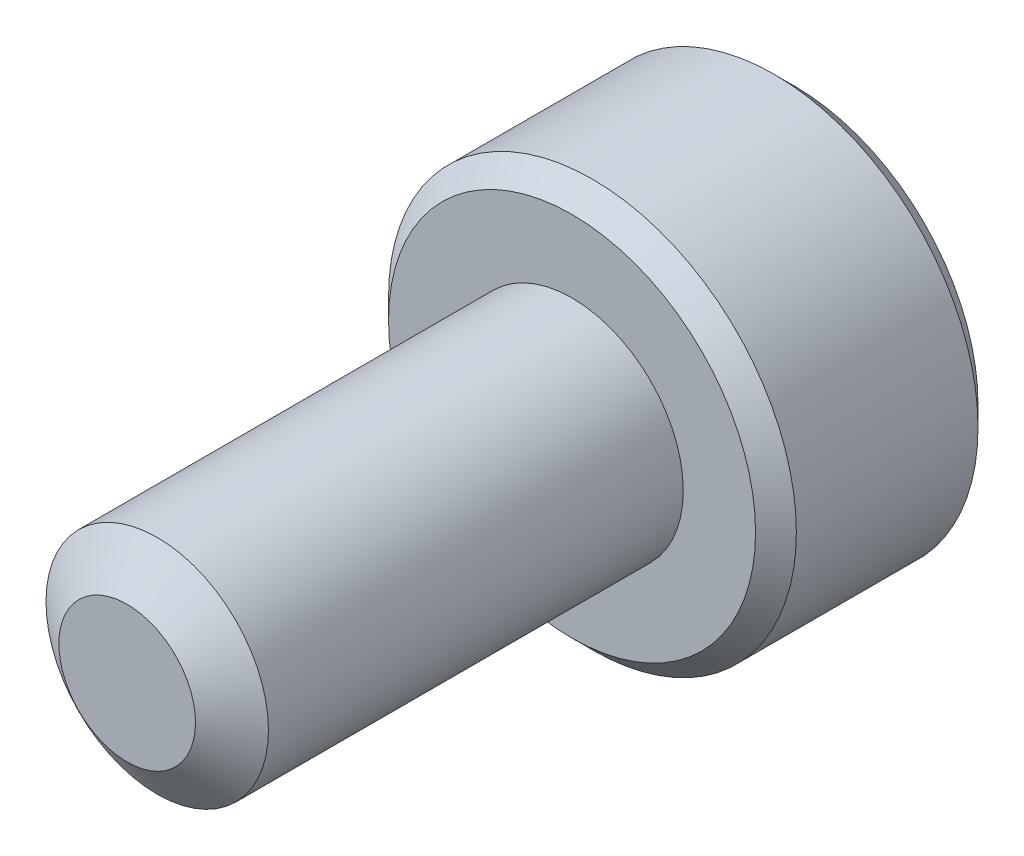
ISO-10303-21;
HEADER;
FILE_DESCRIPTION(('STEP AP214'),'2;1');
FILE_NAME('part.step','',(''),(''),'','','');
FILE_SCHEMA(('AUTOMOTIVE_DESIGN { 1 0 10303 214 1 1 1 1 }'));
ENDSEC;
DATA;
#1=APPLICATION_CONTEXT('core data for automotive mechanical design processes');
#2=APPLICATION_PROTOCOL_DEFINITION('international standard','automotive_design',2000,#1);
#3=PRODUCT_CONTEXT('',#1,'mechanical');
#4=PRODUCT('Part','Part','',(#3));
#5=PRODUCT_RELATED_PRODUCT_CATEGORY('part','',(#4));
#6=PRODUCT_DEFINITION_FORMATION('','',#4);
#7=PRODUCT_DEFINITION_CONTEXT('part definition',#1,'design');
#8=PRODUCT_DEFINITION('design','',#6,#7);
#9=PRODUCT_DEFINITION_SHAPE('','',#8);
#10=(LENGTH_UNIT() NAMED_UNIT(*) SI_UNIT(.MILLI.,.METRE.));
#11=(NAMED_UNIT(*) PLANE_ANGLE_UNIT() SI_UNIT($,.RADIAN.));
#12=(NAMED_UNIT(*) SI_UNIT($,.STERADIAN.) SOLID_ANGLE_UNIT());
#13=UNCERTAINTY_MEASURE_WITH_UNIT(LENGTH_MEASURE(1.E-05),#10,'distance_accuracy_value','');
#14=(GEOMETRIC_REPRESENTATION_CONTEXT(3) GLOBAL_UNCERTAINTY_ASSIGNED_CONTEXT((#13)) GLOBAL_UNIT_ASSIGNED_CONTEXT((#10,
#11,#12)) REPRESENTATION_CONTEXT('',''));
#15=CARTESIAN_POINT('',(0.,0.,0.));
#16=DIRECTION('',(0.,0.,1.));
#17=DIRECTION('',(1.,0.,0.));
#18=AXIS2_PLACEMENT_3D('',#15,#16,#17);
#19=CARTESIAN_POINT('',(0.,0.,-6.));
#20=DIRECTION('',(0.,0.,1.));
#21=DIRECTION('',(1.,0.,0.));
#22=AXIS2_PLACEMENT_3D('',#19,#20,#21);
#23=CYLINDRICAL_SURFACE('',#22,1.5);
#24=CARTESIAN_POINT('',(0.,0.,-6.));
#25=DIRECTION('',(0.,0.,-1.));
#26=DIRECTION('',(-1.,0.,0.));
#27=AXIS2_PLACEMENT_3D('',#24,#25,#26);
#28=CIRCLE('',#27,1.5);
#29=CARTESIAN_POINT('',(-1.5,0.,-6.));
#30=VERTEX_POINT('',#29);
#31=EDGE_CURVE('E216',#30,#30,#28,.F.);
#32=ORIENTED_EDGE('',*,*,#31,.T.);
#33=EDGE_LOOP('',(#32));
#34=FACE_BOUND('',#33,.T.);
#35=CARTESIAN_POINT('',(0.,0.,-0.40525178320938));
#36=DIRECTION('',(0.,0.,1.));
#37=DIRECTION('',(1.,0.,0.));
#38=AXIS2_PLACEMENT_3D('',#35,#36,#37);
#39=CIRCLE('',#38,1.5);
#40=CARTESIAN_POINT('',(1.5,0.,-0.40525178320938));
#41=VERTEX_POINT('',#40);
#42=EDGE_CURVE('E110',#41,#41,#39,.T.);
#43=ORIENTED_EDGE('',*,*,#42,.F.);
#44=EDGE_LOOP('',(#43));
#45=FACE_BOUND('',#44,.T.);
#46=ADVANCED_FACE('F36',(#34,#45),#23,.T.);
#47=CARTESIAN_POINT('',(0.,0.,0.));
#48=DIRECTION('',(0.,0.,-1.));
#49=DIRECTION('',(-1.,0.,0.));
#50=AXIS2_PLACEMENT_3D('',#47,#48,#49);
#51=CONICAL_SURFACE('',#50,0.921240473580834,0.959931088596884);
#52=ORIENTED_EDGE('',*,*,#42,.T.);
#53=EDGE_LOOP('',(#52));
#54=FACE_BOUND('',#53,.T.);
#55=CARTESIAN_POINT('',(0.,0.,0.));
#56=DIRECTION('',(0.,0.,1.));
#57=DIRECTION('',(1.,0.,0.));
#58=AXIS2_PLACEMENT_3D('',#55,#56,#57);
#59=CIRCLE('',#58,0.921240473580834);
#60=CARTESIAN_POINT('',(0.921240473580834,0.,0.));
#61=VERTEX_POINT('',#60);
#62=EDGE_CURVE('E214',#61,#61,#59,.T.);
#63=ORIENTED_EDGE('',*,*,#62,.F.);
#64=EDGE_LOOP('',(#63));
#65=FACE_BOUND('',#64,.T.);
#66=ADVANCED_FACE('F197',(#54,#65),#51,.T.);
#67=CARTESIAN_POINT('',(0.,0.,0.));
#68=DIRECTION('',(0.,0.,1.));
#69=DIRECTION('',(1.,0.,0.));
#70=AXIS2_PLACEMENT_3D('',#67,#68,#69);
#71=PLANE('',#70);
#72=ORIENTED_EDGE('',*,*,#62,.T.);
#73=EDGE_LOOP('',(#72));
#74=FACE_BOUND('',#73,.T.);
#75=ADVANCED_FACE('F194',(#74),#71,.T.);
#76=CARTESIAN_POINT('',(0.,0.,-9.));
#77=DIRECTION('',(0.,0.,1.));
#78=DIRECTION('',(1.,0.,0.));
#79=AXIS2_PLACEMENT_3D('',#76,#77,#78);
#80=CYLINDRICAL_SURFACE('',#79,2.75);
#81=CARTESIAN_POINT('',(0.,0.,-8.725));
#82=DIRECTION('',(0.,0.,-1.));
#83=DIRECTION('',(-1.,0.,0.));
#84=AXIS2_PLACEMENT_3D('',#81,#82,#83);
#85=CIRCLE('',#84,2.75);
#86=CARTESIAN_POINT('',(-2.75,0.,-8.725));
#87=VERTEX_POINT('',#86);
#88=EDGE_CURVE('E44',#87,#87,#85,.F.);
#89=ORIENTED_EDGE('',*,*,#88,.T.);
#90=EDGE_LOOP('',(#89));
#91=FACE_BOUND('',#90,.T.);
#92=CARTESIAN_POINT('',(0.,0.,-6.275));
#93=DIRECTION('',(0.,0.,-1.));
#94=DIRECTION('',(-1.,0.,0.));
#95=AXIS2_PLACEMENT_3D('',#92,#93,#94);
#96=CIRCLE('',#95,2.75);
#97=CARTESIAN_POINT('',(-2.75,0.,-6.275));
#98=VERTEX_POINT('',#97);
#99=EDGE_CURVE('E173',#98,#98,#96,.T.);
#100=ORIENTED_EDGE('',*,*,#99,.T.);
#101=EDGE_LOOP('',(#100));
#102=FACE_BOUND('',#101,.T.);
#103=ADVANCED_FACE('F178',(#91,#102),#80,.T.);
#104=CARTESIAN_POINT('',(0.,0.,-9.));
#105=DIRECTION('',(0.,0.,-1.));
#106=DIRECTION('',(-1.,0.,0.));
#107=AXIS2_PLACEMENT_3D('',#104,#105,#106);
#108=PLANE('',#107);
#109=CARTESIAN_POINT('',(0.,0.,-9.));
#110=DIRECTION('',(0.,0.,-1.));
#111=DIRECTION('',(-1.,0.,0.));
#112=AXIS2_PLACEMENT_3D('',#109,#110,#111);
#113=CIRCLE('',#112,2.475);
#114=CARTESIAN_POINT('',(-2.475,0.,-9.));
#115=VERTEX_POINT('',#114);
#116=EDGE_CURVE('E109',#115,#115,#113,.T.);
#117=ORIENTED_EDGE('',*,*,#116,.T.);
#118=EDGE_LOOP('',(#117));
#119=FACE_BOUND('',#118,.T.);
#120=CARTESIAN_POINT('',(0.,0.,-9.));
#121=DIRECTION('',(0.,0.,-1.));
#122=DIRECTION('',(-1.,0.,0.));
#123=AXIS2_PLACEMENT_3D('',#120,#121,#122);
#124=CIRCLE('',#123,1.44337567297406);
#125=CARTESIAN_POINT('',(-1.25,0.721687836487031,-9.));
#126=VERTEX_POINT('',#125);
#127=CARTESIAN_POINT('',(0.,1.44337567297406,-9.));
#128=VERTEX_POINT('',#127);
#129=EDGE_CURVE('E90',#126,#128,#124,.T.);
#130=ORIENTED_EDGE('',*,*,#129,.F.);
#131=CARTESIAN_POINT('',(-1.25,-0.721687836487032,-9.));
#132=VERTEX_POINT('',#131);
#133=EDGE_CURVE('E50',#132,#126,#124,.T.);
#134=ORIENTED_EDGE('',*,*,#133,.F.);
#135=CARTESIAN_POINT('',(0.,-1.44337567297406,-9.));
#136=VERTEX_POINT('',#135);
#137=EDGE_CURVE('E275',#136,#132,#124,.T.);
#138=ORIENTED_EDGE('',*,*,#137,.F.);
#139=CARTESIAN_POINT('',(1.25,-0.721687836487032,-9.));
#140=VERTEX_POINT('',#139);
#141=EDGE_CURVE('E57',#140,#136,#124,.T.);
#142=ORIENTED_EDGE('',*,*,#141,.F.);
#143=CARTESIAN_POINT('',(1.25,0.721687836487033,-9.));
#144=VERTEX_POINT('',#143);
#145=EDGE_CURVE('E131',#144,#140,#124,.T.);
#146=ORIENTED_EDGE('',*,*,#145,.F.);
#147=EDGE_CURVE('E99',#128,#144,#124,.T.);
#148=ORIENTED_EDGE('',*,*,#147,.F.);
#149=EDGE_LOOP('',(#130,#134,#138,#142,#146,#148));
#150=FACE_BOUND('',#149,.T.);
#151=ADVANCED_FACE('F130',(#119,#150),#108,.T.);
#152=CARTESIAN_POINT('',(0.,0.,-6.));
#153=DIRECTION('',(0.,0.,-1.));
#154=DIRECTION('',(-1.,0.,0.));
#155=AXIS2_PLACEMENT_3D('',#152,#153,#154);
#156=PLANE('',#155);
#157=CARTESIAN_POINT('',(0.,0.,-6.));
#158=DIRECTION('',(0.,0.,-1.));
#159=DIRECTION('',(-1.,0.,0.));
#160=AXIS2_PLACEMENT_3D('',#157,#158,#159);
#161=CIRCLE('',#160,2.475);
#162=CARTESIAN_POINT('',(-2.475,0.,-6.));
#163=VERTEX_POINT('',#162);
#164=EDGE_CURVE('E11',#163,#163,#161,.F.);
#165=ORIENTED_EDGE('',*,*,#164,.T.);
#166=EDGE_LOOP('',(#165));
#167=FACE_BOUND('',#166,.T.);
#168=ORIENTED_EDGE('',*,*,#31,.F.);
#169=EDGE_LOOP('',(#168));
#170=FACE_BOUND('',#169,.T.);
#171=ADVANCED_FACE('F187',(#167,#170),#156,.F.);
#172=CARTESIAN_POINT('',(0.,0.,-9.));
#173=DIRECTION('',(0.,0.,-1.));
#174=DIRECTION('',(-1.,0.,0.));
#175=AXIS2_PLACEMENT_3D('',#172,#173,#174);
#176=CONICAL_SURFACE('',#175,1.44337567297406,0.78539816339745);
#177=ORIENTED_EDGE('',*,*,#147,.T.);
#178=CARTESIAN_POINT('',(-0.000199999999999518,1.4434911430279,-9.00011548390914));
#179=CARTESIAN_POINT('',(0.0427751670715875,1.41867941875065,-8.9753216680551));
#180=CARTESIAN_POINT('',(0.0864690047459492,1.39345276980743,-8.95198373441868));
#181=CARTESIAN_POINT('',(0.175565930841943,1.34201263554194,-8.90925200408454));
#182=CARTESIAN_POINT('',(0.220977498357065,1.31579425481276,-8.88988199236042));
#183=CARTESIAN_POINT('',(0.312547820935261,1.26292610442246,-8.85670048341348));
#184=CARTESIAN_POINT('',(0.358683240175887,1.23628980770471,-8.84280555905266));
#185=CARTESIAN_POINT('',(0.451970080407593,1.18243062538508,-8.82139728216064));
#186=CARTESIAN_POINT('',(0.499118649136381,1.15520938653761,-8.81386794156679));
#187=CARTESIAN_POINT('',(0.580373556887253,1.10829684367467,-8.8070744980507));
#188=CARTESIAN_POINT('',(0.614374876627942,1.08866617256958,-8.80606855910435));
#189=CARTESIAN_POINT('',(0.682317764432479,1.04943932800611,-8.80776141491132));
#190=CARTESIAN_POINT('',(0.716259317655658,1.02984316311599,-8.81046102721554));
#191=CARTESIAN_POINT('',(0.7838148564575,0.990839954603498,-8.81940893031638));
#192=CARTESIAN_POINT('',(0.817428507286776,0.97143310424877,-8.82566052589971));
#193=CARTESIAN_POINT('',(0.884094638217814,0.932943395609905,-8.8413756814139));
#194=CARTESIAN_POINT('',(0.917146871030297,0.9138606800983,-8.85084062008746));
#195=CARTESIAN_POINT('',(1.00179969160026,0.864986351354567,-8.87893139068759));
#196=CARTESIAN_POINT('',(1.05286649242964,0.835502920149076,-8.8996701574522));
#197=CARTESIAN_POINT('',(1.15300085411325,0.777690319475909,-8.94638713467148));
#198=CARTESIAN_POINT('',(1.20207431157827,0.749357745598417,-8.97234829594677));
#199=CARTESIAN_POINT('',(1.2502,0.721572366433194,-9.00011548390914));
#200=B_SPLINE_CURVE_WITH_KNOTS('',3,(#178,#179,#180,#181,#182,#183,#184,#185,#186,#187,#188,
#189,#190,#191,#192,#193,#194,#195,#196,#197,#198,#199),.UNSPECIFIED.,.F.,.F.,(4,2,2,2,2,2,2,2,
2,2,4),(0.,0.166533409618305,0.334037607289762,0.498880396489699,0.663307919240275,
0.780963963458827,0.898645970148453,1.01643764860773,1.1342799317155,1.32148652032141,
1.50809158792573),.UNSPECIFIED.);
#201=EDGE_CURVE('E104',#128,#144,#200,.T.);
#202=ORIENTED_EDGE('',*,*,#201,.F.);
#203=EDGE_LOOP('',(#177,#202));
#204=FACE_BOUND('',#203,.T.);
#205=ADVANCED_FACE('F105',(#204),#176,.F.);
#206=ORIENTED_EDGE('',*,*,#145,.T.);
#207=CARTESIAN_POINT('',(1.25,-1.43934010808077,-9.46298209689233));
#208=CARTESIAN_POINT('',(1.25,-1.40429313005659,-9.43652492263289));
#209=CARTESIAN_POINT('',(1.25,-1.36905087135599,-9.41032716035428));
#210=CARTESIAN_POINT('',(1.25,-1.29809650706311,-9.35855757183958));
#211=CARTESIAN_POINT('',(1.25,-1.26238428576495,-9.3329859043563));
#212=CARTESIAN_POINT('',(1.25,-1.15390111792708,-9.25700599368946));
#213=CARTESIAN_POINT('',(1.25,-1.08031646726264,-9.20774028618957));
#214=CARTESIAN_POINT('',(1.25,-0.926012322755096,-9.11102583026313));
#215=CARTESIAN_POINT('',(1.25,-0.845125318656147,-9.0638412989418));
#216=CARTESIAN_POINT('',(1.25,-0.679311174076602,-8.97753073439041));
#217=CARTESIAN_POINT('',(1.25,-0.594398891026687,-8.9383775346269));
#218=CARTESIAN_POINT('',(1.25,-0.46694481246074,-8.89047722368829));
#219=CARTESIAN_POINT('',(1.25,-0.426289985812821,-8.87672948978634));
#220=CARTESIAN_POINT('',(1.25,-0.343998850091267,-8.85249792745054));
#221=CARTESIAN_POINT('',(1.25,-0.302362473614962,-8.84201432386977));
#222=CARTESIAN_POINT('',(1.25,-0.219052696285665,-8.8250301617483));
#223=CARTESIAN_POINT('',(1.25,-0.1773934284745,-8.81846136047137));
#224=CARTESIAN_POINT('',(1.25,-0.0936293693401921,-8.80943505345776));
#225=CARTESIAN_POINT('',(1.25,-0.051524655854396,-8.80697684099727));
#226=CARTESIAN_POINT('',(1.25,0.0311890576306315,-8.80635406201329));
#227=CARTESIAN_POINT('',(1.25,0.0717969625499303,-8.80803711684625));
#228=CARTESIAN_POINT('',(1.25,0.152668636885197,-8.81526827059791));
#229=CARTESIAN_POINT('',(1.25,0.192932338835358,-8.82081711041311));
#230=CARTESIAN_POINT('',(1.25,0.273499879165295,-8.83557103646496));
#231=CARTESIAN_POINT('',(1.25,0.313792180618512,-8.8448381759641));
#232=CARTESIAN_POINT('',(1.25,0.393496413911458,-8.86653617845735));
#233=CARTESIAN_POINT('',(1.25,0.43290841911506,-8.87896677673065));
#234=CARTESIAN_POINT('',(1.25,0.556992735862299,-8.92277935293144));
#235=CARTESIAN_POINT('',(1.25,0.639898924666086,-8.95915107287596));
#236=CARTESIAN_POINT('',(1.25,0.801816555499702,-9.04001916217834));
#237=CARTESIAN_POINT('',(1.25,0.880812666325045,-9.08454472091199));
#238=CARTESIAN_POINT('',(1.25,1.0317856127975,-9.17640487666663));
#239=CARTESIAN_POINT('',(1.25,1.10391618485086,-9.22348993391625));
#240=CARTESIAN_POINT('',(1.25,1.21018606043311,-9.29627856159854));
#241=CARTESIAN_POINT('',(1.25,1.2451506996938,-9.32079808539336));
#242=CARTESIAN_POINT('',(1.25,1.31460220852737,-9.37048563676568));
#243=CARTESIAN_POINT('',(1.25,1.34908920596618,-9.39565348541552));
#244=CARTESIAN_POINT('',(1.25,1.38337731682912,-9.42109014884122));
#245=B_SPLINE_CURVE_WITH_KNOTS('',3,(#207,#208,#209,#210,#211,#212,#213,#214,#215,#216,#217,
#218,#219,#220,#221,#222,#223,#224,#225,#226,#227,#228,#229,#230,#231,#232,#233,#234,#235,#236,
#237,#238,#239,#240,#241,#242,#243,#244),.UNSPECIFIED.,.F.,.F.,(4,2,2,2,2,2,2,2,2,2,2,2,2,2,2,2,
2,2,4),(0.,0.131732960381448,0.263498984161645,0.529042014455825,0.809741926134617,
1.08947609717225,1.21811634272576,1.346765447839,1.47310084517844,1.59941451973784,
1.72115042167849,1.84290966131735,1.96679153905342,2.09066305366039,2.36146692896009,
2.63325989198491,2.89154668212279,3.01965734507713,3.14773302245628),.UNSPECIFIED.);
#246=EDGE_CURVE('E98',#144,#140,#245,.F.);
#247=ORIENTED_EDGE('',*,*,#246,.F.);
#248=EDGE_LOOP('',(#206,#247));
#249=FACE_BOUND('',#248,.T.);
#250=ADVANCED_FACE('F281',(#249),#176,.F.);
#251=ORIENTED_EDGE('',*,*,#141,.T.);
#252=CARTESIAN_POINT('',(1.2502,-0.721572366433195,-9.00011548390914));
#253=CARTESIAN_POINT('',(1.20722483292841,-0.746384090710445,-8.9753216680551));
#254=CARTESIAN_POINT('',(1.16353099525405,-0.771610739653665,-8.95198373441868));
#255=CARTESIAN_POINT('',(1.07443406915806,-0.823050873919155,-8.90925200408454));
#256=CARTESIAN_POINT('',(1.02902250164294,-0.849269254648334,-8.88988199236042));
#257=CARTESIAN_POINT('',(0.93745217906474,-0.902137405038636,-8.85670048341348));
#258=CARTESIAN_POINT('',(0.891316759824114,-0.928773701756388,-8.84280555905266));
#259=CARTESIAN_POINT('',(0.798029919592408,-0.982632884076013,-8.82139728216064));
#260=CARTESIAN_POINT('',(0.75088135086362,-1.00985412292348,-8.81386794156679));
#261=CARTESIAN_POINT('',(0.669626443112748,-1.05676666578643,-8.8070744980507));
#262=CARTESIAN_POINT('',(0.635625123372059,-1.07639733689152,-8.80606855910435));
#263=CARTESIAN_POINT('',(0.567682235567523,-1.11562418145499,-8.80776141491132));
#264=CARTESIAN_POINT('',(0.533740682344343,-1.1352203463451,-8.81046102721554));
#265=CARTESIAN_POINT('',(0.466185143542501,-1.1742235548576,-8.81940893031638));
#266=CARTESIAN_POINT('',(0.432571492713226,-1.19363040521233,-8.82566052589971));
#267=CARTESIAN_POINT('',(0.365905361782187,-1.23212011385119,-8.8413756814139));
#268=CARTESIAN_POINT('',(0.332853128969705,-1.2512028293628,-8.85084062008746));
#269=CARTESIAN_POINT('',(0.248200308399736,-1.30007715810653,-8.87893139068759));
#270=CARTESIAN_POINT('',(0.197133507570362,-1.32956058931202,-8.8996701574522));
#271=CARTESIAN_POINT('',(0.0969991458867458,-1.38737318998519,-8.94638713467148));
#272=CARTESIAN_POINT('',(0.0479256884217313,-1.41570576386268,-8.97234829594677));
#273=CARTESIAN_POINT('',(-0.000199999999999432,-1.4434911430279,-9.00011548390914));
#274=B_SPLINE_CURVE_WITH_KNOTS('',3,(#252,#253,#254,#255,#256,#257,#258,#259,#260,#261,#262,
#263,#264,#265,#266,#267,#268,#269,#270,#271,#272,#273),.UNSPECIFIED.,.F.,.F.,(4,2,2,2,2,2,2,2,
2,2,4),(0.,0.166533409618304,0.334037607289761,0.498880396489698,0.663307919240274,
0.780963963458826,0.898645970148452,1.01643764860773,1.13427993171549,1.32148652032141,
1.50809158792573),.UNSPECIFIED.);
#275=EDGE_CURVE('E141',#140,#136,#274,.T.);
#276=ORIENTED_EDGE('',*,*,#275,.F.);
#277=EDGE_LOOP('',(#251,#276));
#278=FACE_BOUND('',#277,.T.);
#279=ADVANCED_FACE('F278',(#278),#176,.F.);
#280=ORIENTED_EDGE('',*,*,#137,.T.);
#281=CARTESIAN_POINT('',(0.000200000000000315,-1.4434911430279,-9.00011548390914));
#282=CARTESIAN_POINT('',(-0.0427751670715862,-1.41867941875065,-8.97532166805511));
#283=CARTESIAN_POINT('',(-0.0864690047459475,-1.39345276980743,-8.95198373441869));
#284=CARTESIAN_POINT('',(-0.175565930841941,-1.34201263554194,-8.90925200408454));
#285=CARTESIAN_POINT('',(-0.220977498357063,-1.31579425481276,-8.88988199236042));
#286=CARTESIAN_POINT('',(-0.312547820935259,-1.26292610442246,-8.85670048341348));
#287=CARTESIAN_POINT('',(-0.358683240175885,-1.23628980770471,-8.84280555905266));
#288=CARTESIAN_POINT('',(-0.451970080407592,-1.18243062538508,-8.82139728216064));
#289=CARTESIAN_POINT('',(-0.499118649136379,-1.15520938653761,-8.81386794156679));
#290=CARTESIAN_POINT('',(-0.580373556887252,-1.10829684367467,-8.8070744980507));
#291=CARTESIAN_POINT('',(-0.61437487662794,-1.08866617256958,-8.80606855910435));
#292=CARTESIAN_POINT('',(-0.682317764432477,-1.04943932800611,-8.80776141491132));
#293=CARTESIAN_POINT('',(-0.716259317655657,-1.02984316311599,-8.81046102721554));
#294=CARTESIAN_POINT('',(-0.783814856457499,-0.9908399546035,-8.81940893031638));
#295=CARTESIAN_POINT('',(-0.817428507286774,-0.971433104248772,-8.82566052589971));
#296=CARTESIAN_POINT('',(-0.884094638217813,-0.932943395609906,-8.8413756814139));
#297=CARTESIAN_POINT('',(-0.917146871030295,-0.913860680098301,-8.85084062008746));
#298=CARTESIAN_POINT('',(-1.00179969160026,-0.864986351354568,-8.87893139068759));
#299=CARTESIAN_POINT('',(-1.05286649242964,-0.835502920149076,-8.8996701574522));
#300=CARTESIAN_POINT('',(-1.15300085411326,-0.777690319475909,-8.94638713467148));
#301=CARTESIAN_POINT('',(-1.20207431157827,-0.749357745598417,-8.97234829594677));
#302=CARTESIAN_POINT('',(-1.2502,-0.721572366433195,-9.00011548390914));
#303=B_SPLINE_CURVE_WITH_KNOTS('',3,(#281,#282,#283,#284,#285,#286,#287,#288,#289,#290,#291,
#292,#293,#294,#295,#296,#297,#298,#299,#300,#301,#302),.UNSPECIFIED.,.F.,.F.,(4,2,2,2,2,2,2,2,
2,2,4),(0.,0.166533409618303,0.334037607289761,0.498880396489698,0.663307919240274,
0.780963963458826,0.898645970148453,1.01643764860773,1.13427993171549,1.32148652032141,
1.50809158792574),.UNSPECIFIED.);
#304=EDGE_CURVE('E252',#136,#132,#303,.T.);
#305=ORIENTED_EDGE('',*,*,#304,.F.);
#306=EDGE_LOOP('',(#280,#305));
#307=FACE_BOUND('',#306,.T.);
#308=ADVANCED_FACE('F277',(#307),#176,.F.);
#309=ORIENTED_EDGE('',*,*,#133,.T.);
#310=CARTESIAN_POINT('',(-1.25,-1.43934010829019,-9.46298209705044));
#311=CARTESIAN_POINT('',(-1.25,-1.40429313026013,-9.43652492278491));
#312=CARTESIAN_POINT('',(-1.25,-1.36905087155364,-9.41032716050022));
#313=CARTESIAN_POINT('',(-1.25,-1.29809650724891,-9.3585575719734));
#314=CARTESIAN_POINT('',(-1.25,-1.2623842859448,-9.33298590448407));
#315=CARTESIAN_POINT('',(-1.25,-1.1539011180887,-9.25700599379899));
#316=CARTESIAN_POINT('',(-1.25,-1.08031646741187,-9.20774028628697));
#317=CARTESIAN_POINT('',(-1.25,-0.926012322877301,-9.11102583033562));
#318=CARTESIAN_POINT('',(-1.25,-0.845125318763648,-9.06384129900157));
#319=CARTESIAN_POINT('',(-1.25,-0.679311174153443,-8.97753073442662));
#320=CARTESIAN_POINT('',(-1.25,-0.594398891087584,-8.93837753465223));
#321=CARTESIAN_POINT('',(-1.25,-0.466944812509639,-8.89047722370555));
#322=CARTESIAN_POINT('',(-1.25,-0.426289985866744,-8.87672948980391));
#323=CARTESIAN_POINT('',(-1.25,-0.343998850155402,-8.85249792746773));
#324=CARTESIAN_POINT('',(-1.25,-0.302362473684285,-8.84201432388626));
#325=CARTESIAN_POINT('',(-1.25,-0.219052696365195,-8.8250301617622));
#326=CARTESIAN_POINT('',(-1.25,-0.177393428559044,-8.81846136048343));
#327=CARTESIAN_POINT('',(-1.25,-0.0936293694345978,-8.80943505346499));
#328=CARTESIAN_POINT('',(-1.25,-0.0515246559536487,-8.80697684100152));
#329=CARTESIAN_POINT('',(-1.25,0.0311890575224388,-8.80635406201073));
#330=CARTESIAN_POINT('',(-1.25,0.071796962437632,-8.80803711683992));
#331=CARTESIAN_POINT('',(-1.25,0.152668636765093,-8.81526827058346));
#332=CARTESIAN_POINT('',(-1.25,0.192932338711554,-8.8208171103943));
#333=CARTESIAN_POINT('',(-1.25,0.273499879034189,-8.83557103643701));
#334=CARTESIAN_POINT('',(-1.25,0.313792180483814,-8.84483817593136));
#335=CARTESIAN_POINT('',(-1.25,0.393496413769926,-8.86653617841489));
#336=CARTESIAN_POINT('',(-1.25,0.432908418970283,-8.87896677668328));
#337=CARTESIAN_POINT('',(-1.25,0.556992735685997,-8.92277935286094));
#338=CARTESIAN_POINT('',(-1.25,0.639898924463083,-8.95915107278418));
#339=CARTESIAN_POINT('',(-1.25,0.801816555245347,-9.04001916204164));
#340=CARTESIAN_POINT('',(-1.25,0.880812666046053,-9.08454472075164));
#341=CARTESIAN_POINT('',(-1.25,1.03178561247421,-9.17640487646102));
#342=CARTESIAN_POINT('',(-1.25,1.10391618450775,-9.22348993368924));
#343=CARTESIAN_POINT('',(-1.25,1.2101860600607,-9.29627856133953));
#344=CARTESIAN_POINT('',(-1.25,1.24515069931176,-9.32079808512376));
#345=CARTESIAN_POINT('',(-1.25,1.31460220812614,-9.37048563647494));
#346=CARTESIAN_POINT('',(-1.25,1.3490892055554,-9.39565348511421));
#347=CARTESIAN_POINT('',(-1.25,1.38337731640879,-9.42109014852934));
#348=B_SPLINE_CURVE_WITH_KNOTS('',3,(#310,#311,#312,#313,#314,#315,#316,#317,#318,#319,#320,
#321,#322,#323,#324,#325,#326,#327,#328,#329,#330,#331,#332,#333,#334,#335,#336,#337,#338,#339,
#340,#341,#342,#343,#344,#345,#346,#347),.UNSPECIFIED.,.F.,.F.,(4,2,2,2,2,2,2,2,2,2,2,2,2,2,2,2,
2,2,4),(0.,0.131732960406521,0.263498984211801,0.529042014557081,0.809741926293178,
1.08947609738757,1.21811634292656,1.34676544802529,1.47310084535082,1.59941451989631,
1.72115042182424,1.84290966145034,1.96679153917269,2.09066305376595,2.36146692896707,
2.63325989189267,2.89154668194565,3.01965734485811,3.1477330221954),.UNSPECIFIED.);
#349=EDGE_CURVE('E120',#132,#126,#348,.T.);
#350=ORIENTED_EDGE('',*,*,#349,.F.);
#351=EDGE_LOOP('',(#309,#350));
#352=FACE_BOUND('',#351,.T.);
#353=ADVANCED_FACE('F290',(#352),#176,.F.);
#354=ORIENTED_EDGE('',*,*,#129,.T.);
#355=CARTESIAN_POINT('',(-1.2502,0.721572366433194,-9.00011548390914));
#356=CARTESIAN_POINT('',(-1.20722483292841,0.746384090710444,-8.9753216680551));
#357=CARTESIAN_POINT('',(-1.16353099525405,0.771610739653664,-8.95198373441868));
#358=CARTESIAN_POINT('',(-1.07443406915806,0.823050873919154,-8.90925200408454));
#359=CARTESIAN_POINT('',(-1.02902250164294,0.849269254648333,-8.88988199236042));
#360=CARTESIAN_POINT('',(-0.937452179064741,0.902137405038635,-8.85670048341348));
#361=CARTESIAN_POINT('',(-0.891316759824115,0.928773701756387,-8.84280555905266));
#362=CARTESIAN_POINT('',(-0.798029919592407,0.982632884076013,-8.82139728216064));
#363=CARTESIAN_POINT('',(-0.75088135086362,1.00985412292348,-8.81386794156679));
#364=CARTESIAN_POINT('',(-0.669626443112747,1.05676666578643,-8.8070744980507));
#365=CARTESIAN_POINT('',(-0.635625123372059,1.07639733689152,-8.80606855910435));
#366=CARTESIAN_POINT('',(-0.567682235567522,1.11562418145499,-8.80776141491132));
#367=CARTESIAN_POINT('',(-0.533740682344342,1.1352203463451,-8.81046102721554));
#368=CARTESIAN_POINT('',(-0.4661851435425,1.1742235548576,-8.81940893031638));
#369=CARTESIAN_POINT('',(-0.432571492713225,1.19363040521233,-8.82566052589971));
#370=CARTESIAN_POINT('',(-0.365905361782186,1.23212011385119,-8.8413756814139));
#371=CARTESIAN_POINT('',(-0.332853128969704,1.2512028293628,-8.85084062008746));
#372=CARTESIAN_POINT('',(-0.248200308399735,1.30007715810653,-8.87893139068759));
#373=CARTESIAN_POINT('',(-0.197133507570361,1.32956058931202,-8.8996701574522));
#374=CARTESIAN_POINT('',(-0.096999145886745,1.38737318998519,-8.94638713467148));
#375=CARTESIAN_POINT('',(-0.0479256884217305,1.41570576386268,-8.97234829594677));
#376=CARTESIAN_POINT('',(0.000200000000000219,1.4434911430279,-9.00011548390914));
#377=B_SPLINE_CURVE_WITH_KNOTS('',3,(#355,#356,#357,#358,#359,#360,#361,#362,#363,#364,#365,
#366,#367,#368,#369,#370,#371,#372,#373,#374,#375,#376),.UNSPECIFIED.,.F.,.F.,(4,2,2,2,2,2,2,2,
2,2,4),(0.,0.166533409618305,0.334037607289762,0.498880396489699,0.663307919240276,
0.780963963458828,0.898645970148454,1.01643764860773,1.1342799317155,1.32148652032141,
1.50809158792574),.UNSPECIFIED.);
#378=EDGE_CURVE('E94',#126,#128,#377,.T.);
#379=ORIENTED_EDGE('',*,*,#378,.F.);
#380=EDGE_LOOP('',(#354,#379));
#381=FACE_BOUND('',#380,.T.);
#382=ADVANCED_FACE('F92',(#381),#176,.F.);
#383=CARTESIAN_POINT('',(1.25,2.1650635094611,-7.125));
#384=DIRECTION('',(0.,0.,-1.));
#385=DIRECTION('',(-1.,0.,0.));
#386=AXIS2_PLACEMENT_3D('',#383,#384,#385);
#387=PLANE('',#386);
#388=DIRECTION('',(0.866025403784439,0.5,0.));
#389=VECTOR('',#388,1.);
#390=CARTESIAN_POINT('',(-1.25,0.721687836487032,-7.125));
#391=LINE('',#390,#389);
#392=CARTESIAN_POINT('',(-1.25,0.721687836487032,-7.125));
#393=VERTEX_POINT('',#392);
#394=CARTESIAN_POINT('',(0.,1.44337567297406,-7.125));
#395=VERTEX_POINT('',#394);
#396=EDGE_CURVE('E119',#393,#395,#391,.T.);
#397=ORIENTED_EDGE('',*,*,#396,.T.);
#398=DIRECTION('',(0.866025403784439,-0.5,0.));
#399=VECTOR('',#398,1.);
#400=CARTESIAN_POINT('',(0.,1.44337567297406,-7.125));
#401=LINE('',#400,#399);
#402=CARTESIAN_POINT('',(1.25,0.721687836487032,-7.125));
#403=VERTEX_POINT('',#402);
#404=EDGE_CURVE('E124',#395,#403,#401,.T.);
#405=ORIENTED_EDGE('',*,*,#404,.T.);
#406=DIRECTION('',(0.,-1.,0.));
#407=VECTOR('',#406,1.);
#408=CARTESIAN_POINT('',(1.25,0.721687836487032,-7.125));
#409=LINE('',#408,#407);
#410=CARTESIAN_POINT('',(1.25,-0.721687836487033,-7.125));
#411=VERTEX_POINT('',#410);
#412=EDGE_CURVE('E238',#403,#411,#409,.T.);
#413=ORIENTED_EDGE('',*,*,#412,.T.);
#414=DIRECTION('',(-0.866025403784439,-0.5,0.));
#415=VECTOR('',#414,1.);
#416=CARTESIAN_POINT('',(1.25,-0.721687836487033,-7.125));
#417=LINE('',#416,#415);
#418=CARTESIAN_POINT('',(0.,-1.44337567297406,-7.125));
#419=VERTEX_POINT('',#418);
#420=EDGE_CURVE('E235',#411,#419,#417,.T.);
#421=ORIENTED_EDGE('',*,*,#420,.T.);
#422=DIRECTION('',(-0.866025403784439,0.5,0.));
#423=VECTOR('',#422,1.);
#424=CARTESIAN_POINT('',(0.,-1.44337567297406,-7.125));
#425=LINE('',#424,#423);
#426=CARTESIAN_POINT('',(-1.25,-0.721687836487032,-7.125));
#427=VERTEX_POINT('',#426);
#428=EDGE_CURVE('E232',#419,#427,#425,.T.);
#429=ORIENTED_EDGE('',*,*,#428,.T.);
#430=DIRECTION('',(0.,1.,0.));
#431=VECTOR('',#430,1.);
#432=CARTESIAN_POINT('',(-1.25,-0.721687836487032,-7.125));
#433=LINE('',#432,#431);
#434=EDGE_CURVE('E127',#427,#393,#433,.T.);
#435=ORIENTED_EDGE('',*,*,#434,.T.);
#436=EDGE_LOOP('',(#397,#405,#413,#421,#429,#435));
#437=FACE_BOUND('',#436,.T.);
#438=ADVANCED_FACE('F161',(#437),#387,.T.);
#439=CARTESIAN_POINT('',(0.,1.44337567297406,-7.125));
#440=DIRECTION('',(0.5,0.866025403784439,0.));
#441=DIRECTION('',(-0.866025403784439,0.5,0.));
#442=AXIS2_PLACEMENT_3D('',#439,#440,#441);
#443=PLANE('',#442);
#444=DIRECTION('',(0.,0.,-1.));
#445=VECTOR('',#444,1.);
#446=CARTESIAN_POINT('',(0.,1.44337567297406,-7.125));
#447=LINE('',#446,#445);
#448=EDGE_CURVE('E116',#395,#128,#447,.T.);
#449=ORIENTED_EDGE('',*,*,#448,.T.);
#450=ORIENTED_EDGE('',*,*,#201,.T.);
#451=DIRECTION('',(0.,0.,-1.));
#452=VECTOR('',#451,1.);
#453=CARTESIAN_POINT('',(1.25,0.721687836487032,-7.125));
#454=LINE('',#453,#452);
#455=EDGE_CURVE('E126',#403,#144,#454,.T.);
#456=ORIENTED_EDGE('',*,*,#455,.F.);
#457=ORIENTED_EDGE('',*,*,#404,.F.);
#458=EDGE_LOOP('',(#449,#450,#456,#457));
#459=FACE_BOUND('',#458,.T.);
#460=ADVANCED_FACE('F122',(#459),#443,.F.);
#461=CARTESIAN_POINT('',(1.25,0.721687836487032,-7.125));
#462=DIRECTION('',(1.,0.,0.));
#463=DIRECTION('',(0.,0.,-1.));
#464=AXIS2_PLACEMENT_3D('',#461,#462,#463);
#465=PLANE('',#464);
#466=ORIENTED_EDGE('',*,*,#455,.T.);
#467=ORIENTED_EDGE('',*,*,#246,.T.);
#468=DIRECTION('',(0.,0.,-1.));
#469=VECTOR('',#468,1.);
#470=CARTESIAN_POINT('',(1.25,-0.721687836487033,-7.125));
#471=LINE('',#470,#469);
#472=EDGE_CURVE('E221',#411,#140,#471,.T.);
#473=ORIENTED_EDGE('',*,*,#472,.F.);
#474=ORIENTED_EDGE('',*,*,#412,.F.);
#475=EDGE_LOOP('',(#466,#467,#473,#474));
#476=FACE_BOUND('',#475,.T.);
#477=ADVANCED_FACE('F150',(#476),#465,.F.);
#478=CARTESIAN_POINT('',(1.25,-0.721687836487033,-7.125));
#479=DIRECTION('',(0.5,-0.866025403784439,0.));
#480=DIRECTION('',(0.866025403784439,0.5,0.));
#481=AXIS2_PLACEMENT_3D('',#478,#479,#480);
#482=PLANE('',#481);
#483=ORIENTED_EDGE('',*,*,#472,.T.);
#484=ORIENTED_EDGE('',*,*,#275,.T.);
#485=DIRECTION('',(0.,0.,-1.));
#486=VECTOR('',#485,1.);
#487=CARTESIAN_POINT('',(0.,-1.44337567297406,-7.125));
#488=LINE('',#487,#486);
#489=EDGE_CURVE('E224',#419,#136,#488,.T.);
#490=ORIENTED_EDGE('',*,*,#489,.F.);
#491=ORIENTED_EDGE('',*,*,#420,.F.);
#492=EDGE_LOOP('',(#483,#484,#490,#491));
#493=FACE_BOUND('',#492,.T.);
#494=ADVANCED_FACE('F154',(#493),#482,.F.);
#495=CARTESIAN_POINT('',(0.,-1.44337567297406,-7.125));
#496=DIRECTION('',(-0.5,-0.866025403784439,0.));
#497=DIRECTION('',(0.866025403784439,-0.5,0.));
#498=AXIS2_PLACEMENT_3D('',#495,#496,#497);
#499=PLANE('',#498);
#500=ORIENTED_EDGE('',*,*,#489,.T.);
#501=ORIENTED_EDGE('',*,*,#304,.T.);
#502=DIRECTION('',(0.,0.,-1.));
#503=VECTOR('',#502,1.);
#504=CARTESIAN_POINT('',(-1.25,-0.721687836487032,-7.125));
#505=LINE('',#504,#503);
#506=EDGE_CURVE('E227',#427,#132,#505,.T.);
#507=ORIENTED_EDGE('',*,*,#506,.F.);
#508=ORIENTED_EDGE('',*,*,#428,.F.);
#509=EDGE_LOOP('',(#500,#501,#507,#508));
#510=FACE_BOUND('',#509,.T.);
#511=ADVANCED_FACE('F260',(#510),#499,.F.);
#512=CARTESIAN_POINT('',(-1.25,-0.721687836487032,-7.125));
#513=DIRECTION('',(-1.,0.,0.));
#514=DIRECTION('',(0.,-1.,0.));
#515=AXIS2_PLACEMENT_3D('',#512,#513,#514);
#516=PLANE('',#515);
#517=ORIENTED_EDGE('',*,*,#506,.T.);
#518=ORIENTED_EDGE('',*,*,#349,.T.);
#519=DIRECTION('',(0.,0.,-1.));
#520=VECTOR('',#519,1.);
#521=CARTESIAN_POINT('',(-1.25,0.721687836487032,-7.125));
#522=LINE('',#521,#520);
#523=EDGE_CURVE('E118',#393,#126,#522,.T.);
#524=ORIENTED_EDGE('',*,*,#523,.F.);
#525=ORIENTED_EDGE('',*,*,#434,.F.);
#526=EDGE_LOOP('',(#517,#518,#524,#525));
#527=FACE_BOUND('',#526,.T.);
#528=ADVANCED_FACE('F257',(#527),#516,.F.);
#529=CARTESIAN_POINT('',(-1.25,0.721687836487032,-7.125));
#530=DIRECTION('',(-0.5,0.866025403784439,0.));
#531=DIRECTION('',(-0.866025403784439,-0.5,0.));
#532=AXIS2_PLACEMENT_3D('',#529,#530,#531);
#533=PLANE('',#532);
#534=ORIENTED_EDGE('',*,*,#523,.T.);
#535=ORIENTED_EDGE('',*,*,#378,.T.);
#536=ORIENTED_EDGE('',*,*,#448,.F.);
#537=ORIENTED_EDGE('',*,*,#396,.F.);
#538=EDGE_LOOP('',(#534,#535,#536,#537));
#539=FACE_BOUND('',#538,.T.);
#540=ADVANCED_FACE('F114',(#539),#533,.F.);
#541=CARTESIAN_POINT('',(0.,0.,-9.));
#542=DIRECTION('',(0.,0.,1.));
#543=DIRECTION('',(1.,0.,0.));
#544=AXIS2_PLACEMENT_3D('',#541,#542,#543);
#545=CONICAL_SURFACE('',#544,2.475,0.78539816339745);
#546=ORIENTED_EDGE('',*,*,#88,.F.);
#547=EDGE_LOOP('',(#546));
#548=FACE_BOUND('',#547,.T.);
#549=ORIENTED_EDGE('',*,*,#116,.F.);
#550=EDGE_LOOP('',(#549));
#551=FACE_BOUND('',#550,.T.);
#552=ADVANCED_FACE('F181',(#548,#551),#545,.T.);
#553=CARTESIAN_POINT('',(0.,0.,-6.275));
#554=DIRECTION('',(0.,0.,-1.));
#555=DIRECTION('',(-1.,0.,0.));
#556=AXIS2_PLACEMENT_3D('',#553,#554,#555);
#557=CONICAL_SURFACE('',#556,2.75,0.785398163397448);
#558=ORIENTED_EDGE('',*,*,#164,.F.);
#559=EDGE_LOOP('',(#558));
#560=FACE_BOUND('',#559,.T.);
#561=ORIENTED_EDGE('',*,*,#99,.F.);
#562=EDGE_LOOP('',(#561));
#563=FACE_BOUND('',#562,.T.);
#564=ADVANCED_FACE('F38',(#560,#563),#557,.T.);
#565=CLOSED_SHELL('',(#46,#66,#75,#103,#151,#171,#205,#250,#279,#308,#353,#382,#438,#460,#477,
#494,#511,#528,#540,#552,#564));
#566=MANIFOLD_SOLID_BREP('B2',#565);
#567=ADVANCED_BREP_SHAPE_REPRESENTATION('',(#18,#566),#14);
#568=SHAPE_DEFINITION_REPRESENTATION(#9,#567);
ENDSEC;
END-ISO-10303-21;
